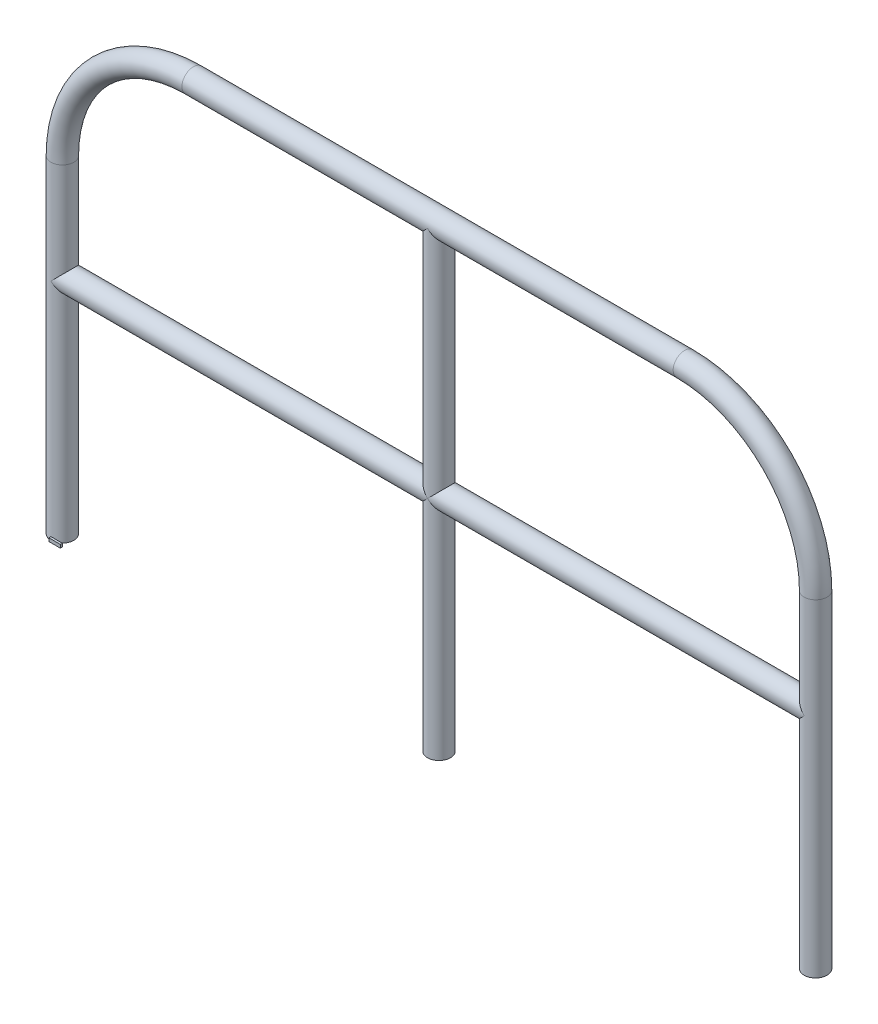
ISO-10303-21;
HEADER;
FILE_DESCRIPTION(('STEP AP214'),'2;1');
FILE_NAME('part.step','',(''),(''),'','','');
FILE_SCHEMA(('AUTOMOTIVE_DESIGN { 1 0 10303 214 1 1 1 1 }'));
ENDSEC;
DATA;
#1=APPLICATION_CONTEXT('core data for automotive mechanical design processes');
#2=APPLICATION_PROTOCOL_DEFINITION('international standard','automotive_design',2000,#1);
#3=PRODUCT_CONTEXT('',#1,'mechanical');
#4=PRODUCT('Part','Part','',(#3));
#5=PRODUCT_RELATED_PRODUCT_CATEGORY('part','',(#4));
#6=PRODUCT_DEFINITION_FORMATION('','',#4);
#7=PRODUCT_DEFINITION_CONTEXT('part definition',#1,'design');
#8=PRODUCT_DEFINITION('design','',#6,#7);
#9=PRODUCT_DEFINITION_SHAPE('','',#8);
#10=(LENGTH_UNIT() NAMED_UNIT(*) SI_UNIT(.MILLI.,.METRE.));
#11=(NAMED_UNIT(*) PLANE_ANGLE_UNIT() SI_UNIT($,.RADIAN.));
#12=(NAMED_UNIT(*) SI_UNIT($,.STERADIAN.) SOLID_ANGLE_UNIT());
#13=UNCERTAINTY_MEASURE_WITH_UNIT(LENGTH_MEASURE(1.E-05),#10,'distance_accuracy_value','');
#14=(GEOMETRIC_REPRESENTATION_CONTEXT(3) GLOBAL_UNCERTAINTY_ASSIGNED_CONTEXT((#13)) GLOBAL_UNIT_ASSIGNED_CONTEXT((#10,
#11,#12)) REPRESENTATION_CONTEXT('',''));
#15=CARTESIAN_POINT('',(0.,0.,0.));
#16=DIRECTION('',(0.,0.,1.));
#17=DIRECTION('',(1.,0.,0.));
#18=AXIS2_PLACEMENT_3D('',#15,#16,#17);
#19=CARTESIAN_POINT('',(1.38663454303622E-13,10.,35.));
#20=DIRECTION('',(-1.,0.,0.));
#21=DIRECTION('',(0.,-1.,0.));
#22=AXIS2_PLACEMENT_3D('',#19,#20,#21);
#23=PLANE('',#22);
#24=DIRECTION('',(0.,0.,-1.));
#25=VECTOR('',#24,1.);
#26=CARTESIAN_POINT('',(0.,0.,35.));
#27=LINE('',#26,#25);
#28=CARTESIAN_POINT('',(0.,0.,41.2225292574394));
#29=VERTEX_POINT('',#28);
#30=CARTESIAN_POINT('',(0.,0.,35.));
#31=VERTEX_POINT('',#30);
#32=EDGE_CURVE('E108',#29,#31,#27,.T.);
#33=ORIENTED_EDGE('',*,*,#32,.F.);
#34=DIRECTION('',(0.,-1.,0.));
#35=VECTOR('',#34,1.);
#36=CARTESIAN_POINT('',(1.38663454303622E-13,10.,41.2225292574394));
#37=LINE('',#36,#35);
#38=CARTESIAN_POINT('',(1.38663454303622E-13,10.,41.2225292574394));
#39=VERTEX_POINT('',#38);
#40=EDGE_CURVE('E12',#39,#29,#37,.T.);
#41=ORIENTED_EDGE('',*,*,#40,.F.);
#42=DIRECTION('',(0.,0.,-1.));
#43=VECTOR('',#42,1.);
#44=CARTESIAN_POINT('',(1.38663454303622E-13,10.,35.));
#45=LINE('',#44,#43);
#46=CARTESIAN_POINT('',(1.38663454303622E-13,10.,35.));
#47=VERTEX_POINT('',#46);
#48=EDGE_CURVE('E102',#39,#47,#45,.T.);
#49=ORIENTED_EDGE('',*,*,#48,.T.);
#50=DIRECTION('',(0.,-1.,0.));
#51=VECTOR('',#50,1.);
#52=CARTESIAN_POINT('',(1.38663454303622E-13,10.,35.));
#53=LINE('',#52,#51);
#54=EDGE_CURVE('E47',#47,#31,#53,.T.);
#55=ORIENTED_EDGE('',*,*,#54,.T.);
#56=EDGE_LOOP('',(#33,#41,#49,#55));
#57=FACE_BOUND('',#56,.T.);
#58=ADVANCED_FACE('F44',(#57),#23,.T.);
#59=CARTESIAN_POINT('',(1.38663454303622E-13,10.,41.2225292574394));
#60=DIRECTION('',(0.,0.,1.));
#61=DIRECTION('',(1.,0.,0.));
#62=AXIS2_PLACEMENT_3D('',#59,#60,#61);
#63=PLANE('',#62);
#64=DIRECTION('',(-1.,0.,0.));
#65=VECTOR('',#64,1.);
#66=CARTESIAN_POINT('',(0.,0.,41.2225292574394));
#67=LINE('',#66,#65);
#68=CARTESIAN_POINT('',(35.,-4.85322090062678E-13,41.2225292574394));
#69=VERTEX_POINT('',#68);
#70=EDGE_CURVE('E104',#69,#29,#67,.T.);
#71=ORIENTED_EDGE('',*,*,#70,.F.);
#72=DIRECTION('',(0.,-1.,0.));
#73=VECTOR('',#72,1.);
#74=CARTESIAN_POINT('',(35.0000000000001,9.99999999999952,41.2225292574394));
#75=LINE('',#74,#73);
#76=CARTESIAN_POINT('',(35.0000000000001,9.99999999999952,41.2225292574394));
#77=VERTEX_POINT('',#76);
#78=EDGE_CURVE('E53',#77,#69,#75,.T.);
#79=ORIENTED_EDGE('',*,*,#78,.F.);
#80=DIRECTION('',(-1.,0.,0.));
#81=VECTOR('',#80,1.);
#82=CARTESIAN_POINT('',(1.38663454303622E-13,10.,41.2225292574394));
#83=LINE('',#82,#81);
#84=EDGE_CURVE('E99',#77,#39,#83,.T.);
#85=ORIENTED_EDGE('',*,*,#84,.T.);
#86=ORIENTED_EDGE('',*,*,#40,.T.);
#87=EDGE_LOOP('',(#71,#79,#85,#86));
#88=FACE_BOUND('',#87,.T.);
#89=ADVANCED_FACE('F118',(#88),#63,.T.);
#90=CARTESIAN_POINT('',(35.0000000000001,9.99999999999952,35.));
#91=DIRECTION('',(1.,0.,0.));
#92=DIRECTION('',(0.,1.,0.));
#93=AXIS2_PLACEMENT_3D('',#90,#91,#92);
#94=PLANE('',#93);
#95=DIRECTION('',(0.,0.,1.));
#96=VECTOR('',#95,1.);
#97=CARTESIAN_POINT('',(35.,-4.85322090062678E-13,35.));
#98=LINE('',#97,#96);
#99=CARTESIAN_POINT('',(35.,-4.85322090062678E-13,35.));
#100=VERTEX_POINT('',#99);
#101=EDGE_CURVE('E94',#100,#69,#98,.T.);
#102=ORIENTED_EDGE('',*,*,#101,.F.);
#103=DIRECTION('',(0.,-1.,0.));
#104=VECTOR('',#103,1.);
#105=CARTESIAN_POINT('',(35.0000000000001,9.99999999999952,35.));
#106=LINE('',#105,#104);
#107=CARTESIAN_POINT('',(35.0000000000001,9.99999999999952,35.));
#108=VERTEX_POINT('',#107);
#109=EDGE_CURVE('E89',#108,#100,#106,.T.);
#110=ORIENTED_EDGE('',*,*,#109,.F.);
#111=DIRECTION('',(0.,0.,1.));
#112=VECTOR('',#111,1.);
#113=CARTESIAN_POINT('',(35.0000000000001,9.99999999999952,35.));
#114=LINE('',#113,#112);
#115=EDGE_CURVE('E92',#108,#77,#114,.T.);
#116=ORIENTED_EDGE('',*,*,#115,.T.);
#117=ORIENTED_EDGE('',*,*,#78,.T.);
#118=EDGE_LOOP('',(#102,#110,#116,#117));
#119=FACE_BOUND('',#118,.T.);
#120=ADVANCED_FACE('F91',(#119),#94,.T.);
#121=CARTESIAN_POINT('',(1.38663454303622E-13,10.,35.));
#122=DIRECTION('',(0.,0.,-1.));
#123=DIRECTION('',(-1.,0.,0.));
#124=AXIS2_PLACEMENT_3D('',#121,#122,#123);
#125=PLANE('',#124);
#126=DIRECTION('',(1.,0.,0.));
#127=VECTOR('',#126,1.);
#128=CARTESIAN_POINT('',(0.,0.,35.));
#129=LINE('',#128,#127);
#130=EDGE_CURVE('E111',#31,#100,#129,.T.);
#131=ORIENTED_EDGE('',*,*,#130,.F.);
#132=ORIENTED_EDGE('',*,*,#54,.F.);
#133=DIRECTION('',(1.,0.,0.));
#134=VECTOR('',#133,1.);
#135=CARTESIAN_POINT('',(1.38663454303622E-13,10.,35.));
#136=LINE('',#135,#134);
#137=EDGE_CURVE('E98',#47,#108,#136,.T.);
#138=ORIENTED_EDGE('',*,*,#137,.T.);
#139=ORIENTED_EDGE('',*,*,#109,.T.);
#140=EDGE_LOOP('',(#131,#132,#138,#139));
#141=FACE_BOUND('',#140,.T.);
#142=ADVANCED_FACE('F101',(#141),#125,.T.);
#143=CARTESIAN_POINT('',(1.38663454303622E-13,10.,0.));
#144=DIRECTION('',(0.,1.,0.));
#145=DIRECTION('',(-1.,0.,0.));
#146=AXIS2_PLACEMENT_3D('',#143,#144,#145);
#147=PLANE('',#146);
#148=ORIENTED_EDGE('',*,*,#48,.F.);
#149=ORIENTED_EDGE('',*,*,#84,.F.);
#150=ORIENTED_EDGE('',*,*,#115,.F.);
#151=ORIENTED_EDGE('',*,*,#137,.F.);
#152=EDGE_LOOP('',(#148,#149,#150,#151));
#153=FACE_BOUND('',#152,.T.);
#154=ADVANCED_FACE('F97',(#153),#147,.T.);
#155=CARTESIAN_POINT('',(0.,0.,0.));
#156=DIRECTION('',(0.,1.,0.));
#157=DIRECTION('',(-1.,0.,0.));
#158=AXIS2_PLACEMENT_3D('',#155,#156,#157);
#159=PLANE('',#158);
#160=ORIENTED_EDGE('',*,*,#32,.T.);
#161=ORIENTED_EDGE('',*,*,#130,.T.);
#162=ORIENTED_EDGE('',*,*,#101,.T.);
#163=ORIENTED_EDGE('',*,*,#70,.T.);
#164=EDGE_LOOP('',(#160,#161,#162,#163));
#165=FACE_BOUND('',#164,.T.);
#166=ADVANCED_FACE('F117',(#165),#159,.F.);
#167=CLOSED_SHELL('',(#58,#89,#120,#142,#154,#166));
#168=MANIFOLD_SOLID_BREP('B2',#167);
#169=CARTESIAN_POINT('',(2300.,1000.,0.));
#170=DIRECTION('',(0.,-1.,0.));
#171=DIRECTION('',(1.,0.,0.));
#172=AXIS2_PLACEMENT_3D('',#169,#170,#171);
#173=CYLINDRICAL_SURFACE('',#172,35.);
#174=CARTESIAN_POINT('',(2300.,-2.22044604925031E-13,0.));
#175=DIRECTION('',(0.,-1.,0.));
#176=DIRECTION('',(0.,0.,1.));
#177=AXIS2_PLACEMENT_3D('',#174,#175,#176);
#178=CIRCLE('',#177,35.);
#179=CARTESIAN_POINT('',(2300.,-2.22044604925031E-13,35.));
#180=VERTEX_POINT('',#179);
#181=EDGE_CURVE('E231',#180,#180,#178,.T.);
#182=ORIENTED_EDGE('',*,*,#181,.F.);
#183=EDGE_LOOP('',(#182));
#184=FACE_BOUND('',#183,.T.);
#185=CARTESIAN_POINT('',(2300.,1000.,0.));
#186=DIRECTION('',(0.,-1.,0.));
#187=DIRECTION('',(0.,0.,1.));
#188=AXIS2_PLACEMENT_3D('',#185,#186,#187);
#189=CIRCLE('',#188,35.);
#190=CARTESIAN_POINT('',(2335.,1000.,0.));
#191=VERTEX_POINT('',#190);
#192=EDGE_CURVE('E228',#191,#191,#189,.T.);
#193=ORIENTED_EDGE('',*,*,#192,.T.);
#194=EDGE_LOOP('',(#193));
#195=FACE_BOUND('',#194,.T.);
#196=CARTESIAN_POINT('',(2300.,685.754772244536,0.));
#197=DIRECTION('',(0.707106781186548,-0.707106781186547,0.));
#198=DIRECTION('',(-0.707106781186547,-0.707106781186548,0.));
#199=AXIS2_PLACEMENT_3D('',#196,#197,#198);
#200=ELLIPSE('',#199,49.4974746830583,35.);
#201=CARTESIAN_POINT('',(2300.,685.754772244536,35.));
#202=VERTEX_POINT('',#201);
#203=CARTESIAN_POINT('',(2300.,685.754772244536,-35.));
#204=VERTEX_POINT('',#203);
#205=EDGE_CURVE('E204',#202,#204,#200,.T.);
#206=ORIENTED_EDGE('',*,*,#205,.T.);
#207=CARTESIAN_POINT('',(2300.,685.754772244536,0.));
#208=DIRECTION('',(-0.707106781186547,-0.707106781186548,0.));
#209=DIRECTION('',(0.707106781186548,-0.707106781186547,0.));
#210=AXIS2_PLACEMENT_3D('',#207,#208,#209);
#211=ELLIPSE('',#210,49.4974746830584,35.);
#212=EDGE_CURVE('E186',#204,#202,#211,.F.);
#213=ORIENTED_EDGE('',*,*,#212,.T.);
#214=EDGE_LOOP('',(#206,#213));
#215=FACE_BOUND('',#214,.T.);
#216=ADVANCED_FACE('F167',(#184,#195,#215),#173,.T.);
#217=CARTESIAN_POINT('',(0.,999.999999999997,0.));
#218=DIRECTION('',(0.,-1.,0.));
#219=DIRECTION('',(0.,0.,-1.));
#220=AXIS2_PLACEMENT_3D('',#217,#218,#219);
#221=CYLINDRICAL_SURFACE('',#220,35.);
#222=CARTESIAN_POINT('',(0.,0.,0.));
#223=DIRECTION('',(0.,1.,0.));
#224=DIRECTION('',(0.,0.,1.));
#225=AXIS2_PLACEMENT_3D('',#222,#223,#224);
#226=CIRCLE('',#225,35.);
#227=CARTESIAN_POINT('',(0.,0.,35.));
#228=VERTEX_POINT('',#227);
#229=EDGE_CURVE('E213',#228,#228,#226,.T.);
#230=ORIENTED_EDGE('',*,*,#229,.T.);
#231=EDGE_LOOP('',(#230));
#232=FACE_BOUND('',#231,.T.);
#233=CARTESIAN_POINT('',(0.,999.999999999997,0.));
#234=DIRECTION('',(0.,1.,0.));
#235=DIRECTION('',(0.,0.,1.));
#236=AXIS2_PLACEMENT_3D('',#233,#234,#235);
#237=CIRCLE('',#236,35.);
#238=CARTESIAN_POINT('',(-35.,999.999999999997,0.));
#239=VERTEX_POINT('',#238);
#240=EDGE_CURVE('E217',#239,#239,#237,.T.);
#241=ORIENTED_EDGE('',*,*,#240,.F.);
#242=EDGE_LOOP('',(#241));
#243=FACE_BOUND('',#242,.T.);
#244=CARTESIAN_POINT('',(0.,685.754772244536,0.));
#245=DIRECTION('',(-0.707106781186547,-0.707106781186547,0.));
#246=DIRECTION('',(0.707106781186547,-0.707106781186547,0.));
#247=AXIS2_PLACEMENT_3D('',#244,#245,#246);
#248=ELLIPSE('',#247,49.4974746830583,35.);
#249=CARTESIAN_POINT('',(0.,685.754772244536,35.));
#250=VERTEX_POINT('',#249);
#251=CARTESIAN_POINT('',(0.,685.754772244536,-35.));
#252=VERTEX_POINT('',#251);
#253=EDGE_CURVE('E208',#250,#252,#248,.F.);
#254=ORIENTED_EDGE('',*,*,#253,.F.);
#255=CARTESIAN_POINT('',(0.,685.754772244536,0.));
#256=DIRECTION('',(0.707106781186547,-0.707106781186547,0.));
#257=DIRECTION('',(-0.707106781186547,-0.707106781186547,0.));
#258=AXIS2_PLACEMENT_3D('',#255,#256,#257);
#259=ELLIPSE('',#258,49.4974746830583,35.);
#260=EDGE_CURVE('E375',#252,#250,#259,.T.);
#261=ORIENTED_EDGE('',*,*,#260,.F.);
#262=EDGE_LOOP('',(#254,#261));
#263=FACE_BOUND('',#262,.T.);
#264=ADVANCED_FACE('F253',(#232,#243,#263),#221,.T.);
#265=CARTESIAN_POINT('',(1150.,1400.,0.));
#266=DIRECTION('',(0.,-1.,0.));
#267=DIRECTION('',(0.,0.,-1.));
#268=AXIS2_PLACEMENT_3D('',#265,#266,#267);
#269=CYLINDRICAL_SURFACE('',#268,35.0000000000001);
#270=CARTESIAN_POINT('',(1150.,1400.,0.));
#271=DIRECTION('',(0.707106781186547,0.707106781186547,0.));
#272=DIRECTION('',(0.707106781186547,-0.707106781186547,0.));
#273=AXIS2_PLACEMENT_3D('',#270,#271,#272);
#274=ELLIPSE('',#273,49.4974746830584,35.);
#275=CARTESIAN_POINT('',(1150.,1400.,-35.));
#276=VERTEX_POINT('',#275);
#277=CARTESIAN_POINT('',(1150.,1400.,35.));
#278=VERTEX_POINT('',#277);
#279=EDGE_CURVE('E234',#276,#278,#274,.F.);
#280=ORIENTED_EDGE('',*,*,#279,.T.);
#281=CARTESIAN_POINT('',(1150.,1400.,0.));
#282=DIRECTION('',(0.707106781186547,-0.707106781186547,0.));
#283=DIRECTION('',(0.707106781186547,0.707106781186547,0.));
#284=AXIS2_PLACEMENT_3D('',#281,#282,#283);
#285=ELLIPSE('',#284,49.4974746830584,35.);
#286=EDGE_CURVE('E237',#278,#276,#285,.T.);
#287=ORIENTED_EDGE('',*,*,#286,.T.);
#288=EDGE_LOOP('',(#280,#287));
#289=FACE_BOUND('',#288,.T.);
#290=CARTESIAN_POINT('',(1150.,685.754772244536,0.));
#291=DIRECTION('',(0.707106781186547,-0.707106781186547,0.));
#292=DIRECTION('',(-0.707106781186547,-0.707106781186547,0.));
#293=AXIS2_PLACEMENT_3D('',#290,#291,#292);
#294=ELLIPSE('',#293,49.4974746830584,35.0000000000001);
#295=CARTESIAN_POINT('',(1150.,685.754772244536,35.0000000000001));
#296=VERTEX_POINT('',#295);
#297=CARTESIAN_POINT('',(1150.,685.754772244536,-35.0000000000001));
#298=VERTEX_POINT('',#297);
#299=EDGE_CURVE('E179',#296,#298,#294,.F.);
#300=ORIENTED_EDGE('',*,*,#299,.T.);
#301=CARTESIAN_POINT('',(1150.,685.754772244536,0.));
#302=DIRECTION('',(-0.707106781186547,-0.707106781186547,0.));
#303=DIRECTION('',(0.707106781186547,-0.707106781186547,0.));
#304=AXIS2_PLACEMENT_3D('',#301,#302,#303);
#305=ELLIPSE('',#304,49.4974746830584,35.0000000000001);
#306=EDGE_CURVE('E42',#298,#296,#305,.F.);
#307=ORIENTED_EDGE('',*,*,#306,.T.);
#308=EDGE_LOOP('',(#300,#307));
#309=FACE_BOUND('',#308,.T.);
#310=ADVANCED_FACE('F250',(#289,#309),#269,.T.);
#311=CARTESIAN_POINT('',(1900.,1000.,0.));
#312=DIRECTION('',(0.,0.,-1.));
#313=DIRECTION('',(-1.,0.,0.));
#314=AXIS2_PLACEMENT_3D('',#311,#312,#313);
#315=TOROIDAL_SURFACE('',#314,400.,35.);
#316=CARTESIAN_POINT('',(1900.,1400.,0.));
#317=DIRECTION('',(1.,0.,0.));
#318=DIRECTION('',(0.,0.,1.));
#319=AXIS2_PLACEMENT_3D('',#316,#317,#318);
#320=CIRCLE('',#319,35.);
#321=CARTESIAN_POINT('',(1900.,1435.,0.));
#322=VERTEX_POINT('',#321);
#323=EDGE_CURVE('E225',#322,#322,#320,.T.);
#324=CARTESIAN_POINT('',(1900.,1000.,0.));
#325=DIRECTION('',(0.,0.,-1.));
#326=DIRECTION('',(-1.,0.,0.));
#327=AXIS2_PLACEMENT_3D('',#324,#325,#326);
#328=CIRCLE('',#327,435.);
#329=EDGE_CURVE('',#322,#191,#328,.T.);
#330=ORIENTED_EDGE('',*,*,#323,.T.);
#331=ORIENTED_EDGE('',*,*,#192,.F.);
#332=ORIENTED_EDGE('',*,*,#329,.T.);
#333=ORIENTED_EDGE('',*,*,#329,.F.);
#334=EDGE_LOOP('',(#330,#332,#331,#333));
#335=FACE_BOUND('',#334,.T.);
#336=ADVANCED_FACE('F252',(#335),#315,.T.);
#337=CARTESIAN_POINT('',(400.000000000003,1400.,0.));
#338=DIRECTION('',(1.,0.,0.));
#339=DIRECTION('',(0.,0.,-1.));
#340=AXIS2_PLACEMENT_3D('',#337,#338,#339);
#341=CYLINDRICAL_SURFACE('',#340,35.);
#342=ORIENTED_EDGE('',*,*,#286,.F.);
#343=ORIENTED_EDGE('',*,*,#279,.F.);
#344=EDGE_LOOP('',(#342,#343));
#345=FACE_BOUND('',#344,.T.);
#346=CARTESIAN_POINT('',(400.000000000003,1400.,0.));
#347=DIRECTION('',(1.,0.,0.));
#348=DIRECTION('',(0.,0.,1.));
#349=AXIS2_PLACEMENT_3D('',#346,#347,#348);
#350=CIRCLE('',#349,35.);
#351=CARTESIAN_POINT('',(400.000000000003,1435.,0.));
#352=VERTEX_POINT('',#351);
#353=EDGE_CURVE('E220',#352,#352,#350,.T.);
#354=ORIENTED_EDGE('',*,*,#353,.T.);
#355=EDGE_LOOP('',(#354));
#356=FACE_BOUND('',#355,.T.);
#357=ORIENTED_EDGE('',*,*,#323,.F.);
#358=EDGE_LOOP('',(#357));
#359=FACE_BOUND('',#358,.T.);
#360=ADVANCED_FACE('F260',(#345,#356,#359),#341,.T.);
#361=CARTESIAN_POINT('',(400.,1000.,0.));
#362=DIRECTION('',(0.,0.,-1.));
#363=DIRECTION('',(-1.,0.,0.));
#364=AXIS2_PLACEMENT_3D('',#361,#362,#363);
#365=TOROIDAL_SURFACE('',#364,400.,35.);
#366=CARTESIAN_POINT('',(400.,1000.,0.));
#367=DIRECTION('',(0.,0.,-1.));
#368=DIRECTION('',(-1.,0.,0.));
#369=AXIS2_PLACEMENT_3D('',#366,#367,#368);
#370=CIRCLE('',#369,435.);
#371=EDGE_CURVE('',#239,#352,#370,.T.);
#372=ORIENTED_EDGE('',*,*,#240,.T.);
#373=ORIENTED_EDGE('',*,*,#353,.F.);
#374=ORIENTED_EDGE('',*,*,#371,.T.);
#375=ORIENTED_EDGE('',*,*,#371,.F.);
#376=EDGE_LOOP('',(#372,#374,#373,#375));
#377=FACE_BOUND('',#376,.T.);
#378=ADVANCED_FACE('F281',(#377),#365,.T.);
#379=CARTESIAN_POINT('',(2300.,-2.22044604925031E-13,0.));
#380=DIRECTION('',(0.,-1.,0.));
#381=DIRECTION('',(0.,0.,1.));
#382=AXIS2_PLACEMENT_3D('',#379,#380,#381);
#383=PLANE('',#382);
#384=ORIENTED_EDGE('',*,*,#181,.T.);
#385=EDGE_LOOP('',(#384));
#386=FACE_BOUND('',#385,.T.);
#387=ADVANCED_FACE('F278',(#386),#383,.T.);
#388=CARTESIAN_POINT('',(0.,0.,0.));
#389=DIRECTION('',(0.,1.,0.));
#390=DIRECTION('',(0.,0.,1.));
#391=AXIS2_PLACEMENT_3D('',#388,#389,#390);
#392=PLANE('',#391);
#393=ORIENTED_EDGE('',*,*,#229,.F.);
#394=EDGE_LOOP('',(#393));
#395=FACE_BOUND('',#394,.T.);
#396=ADVANCED_FACE('F280',(#395),#392,.F.);
#397=CARTESIAN_POINT('',(2300.,685.754772244536,0.));
#398=DIRECTION('',(-1.,0.,0.));
#399=DIRECTION('',(0.,0.,1.));
#400=AXIS2_PLACEMENT_3D('',#397,#398,#399);
#401=CYLINDRICAL_SURFACE('',#400,35.);
#402=ORIENTED_EDGE('',*,*,#212,.F.);
#403=ORIENTED_EDGE('',*,*,#205,.F.);
#404=EDGE_LOOP('',(#402,#403));
#405=FACE_BOUND('',#404,.T.);
#406=CARTESIAN_POINT('',(1150.,685.754772244536,0.));
#407=DIRECTION('',(-0.707106781186547,-0.707106781186547,0.));
#408=DIRECTION('',(0.707106781186547,-0.707106781186547,0.));
#409=AXIS2_PLACEMENT_3D('',#406,#407,#408);
#410=ELLIPSE('',#409,49.4974746830584,35.0000000000001);
#411=EDGE_CURVE('E174',#298,#296,#410,.T.);
#412=ORIENTED_EDGE('',*,*,#411,.F.);
#413=ORIENTED_EDGE('',*,*,#299,.F.);
#414=EDGE_LOOP('',(#412,#413));
#415=FACE_BOUND('',#414,.T.);
#416=ADVANCED_FACE('F205',(#405,#415),#401,.T.);
#417=CARTESIAN_POINT('',(1150.,0.,0.));
#418=DIRECTION('',(0.,-1.,0.));
#419=DIRECTION('',(0.,0.,-1.));
#420=AXIS2_PLACEMENT_3D('',#417,#418,#419);
#421=PLANE('',#420);
#422=CARTESIAN_POINT('',(1150.,0.,0.));
#423=DIRECTION('',(0.,-1.,0.));
#424=DIRECTION('',(0.,0.,-1.));
#425=AXIS2_PLACEMENT_3D('',#422,#423,#424);
#426=CIRCLE('',#425,35.0000000000001);
#427=CARTESIAN_POINT('',(1150.,0.,-35.0000000000001));
#428=VERTEX_POINT('',#427);
#429=EDGE_CURVE('E210',#428,#428,#426,.T.);
#430=ORIENTED_EDGE('',*,*,#429,.T.);
#431=EDGE_LOOP('',(#430));
#432=FACE_BOUND('',#431,.T.);
#433=ADVANCED_FACE('F267',(#432),#421,.T.);
#434=ORIENTED_EDGE('',*,*,#429,.F.);
#435=EDGE_LOOP('',(#434));
#436=FACE_BOUND('',#435,.T.);
#437=CARTESIAN_POINT('',(1150.,685.754772244536,0.));
#438=DIRECTION('',(0.707106781186547,-0.707106781186547,0.));
#439=DIRECTION('',(-0.707106781186547,-0.707106781186547,0.));
#440=AXIS2_PLACEMENT_3D('',#437,#438,#439);
#441=ELLIPSE('',#440,49.4974746830584,35.0000000000001);
#442=EDGE_CURVE('E241',#296,#298,#441,.T.);
#443=ORIENTED_EDGE('',*,*,#442,.T.);
#444=ORIENTED_EDGE('',*,*,#411,.T.);
#445=EDGE_LOOP('',(#443,#444));
#446=FACE_BOUND('',#445,.T.);
#447=ADVANCED_FACE('F245',(#436,#446),#269,.T.);
#448=ORIENTED_EDGE('',*,*,#306,.F.);
#449=ORIENTED_EDGE('',*,*,#442,.F.);
#450=EDGE_LOOP('',(#448,#449));
#451=FACE_BOUND('',#450,.T.);
#452=ORIENTED_EDGE('',*,*,#260,.T.);
#453=ORIENTED_EDGE('',*,*,#253,.T.);
#454=EDGE_LOOP('',(#452,#453));
#455=FACE_BOUND('',#454,.T.);
#456=ADVANCED_FACE('F248',(#451,#455),#401,.T.);
#457=CLOSED_SHELL('',(#216,#264,#310,#336,#360,#378,#387,#396,#416,#433,#447,#456));
#458=MANIFOLD_SOLID_BREP('B6',#457);
#459=ADVANCED_BREP_SHAPE_REPRESENTATION('',(#18,#168,#458),#14);
#460=SHAPE_DEFINITION_REPRESENTATION(#9,#459);
ENDSEC;
END-ISO-10303-21;
